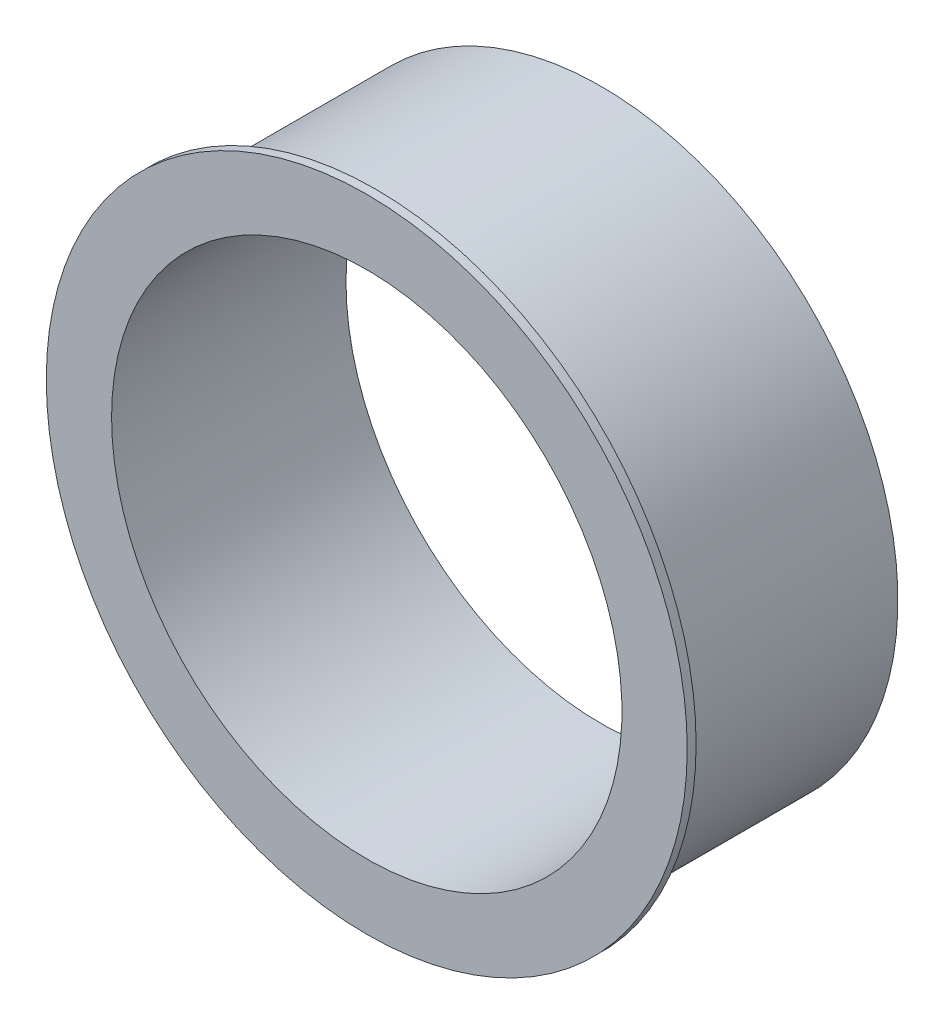
ISO-10303-21;
HEADER;
FILE_DESCRIPTION(('STEP AP214'),'2;1');
FILE_NAME('part.step','',(''),(''),'','','');
FILE_SCHEMA(('AUTOMOTIVE_DESIGN { 1 0 10303 214 1 1 1 1 }'));
ENDSEC;
DATA;
#1=APPLICATION_CONTEXT('core data for automotive mechanical design processes');
#2=APPLICATION_PROTOCOL_DEFINITION('international standard','automotive_design',2000,#1);
#3=PRODUCT_CONTEXT('',#1,'mechanical');
#4=PRODUCT('Part','Part','',(#3));
#5=PRODUCT_RELATED_PRODUCT_CATEGORY('part','',(#4));
#6=PRODUCT_DEFINITION_FORMATION('','',#4);
#7=PRODUCT_DEFINITION_CONTEXT('part definition',#1,'design');
#8=PRODUCT_DEFINITION('design','',#6,#7);
#9=PRODUCT_DEFINITION_SHAPE('','',#8);
#10=(LENGTH_UNIT() NAMED_UNIT(*) SI_UNIT(.MILLI.,.METRE.));
#11=(NAMED_UNIT(*) PLANE_ANGLE_UNIT() SI_UNIT($,.RADIAN.));
#12=(NAMED_UNIT(*) SI_UNIT($,.STERADIAN.) SOLID_ANGLE_UNIT());
#13=UNCERTAINTY_MEASURE_WITH_UNIT(LENGTH_MEASURE(1.E-05),#10,'distance_accuracy_value','');
#14=(GEOMETRIC_REPRESENTATION_CONTEXT(3) GLOBAL_UNCERTAINTY_ASSIGNED_CONTEXT((#13)) GLOBAL_UNIT_ASSIGNED_CONTEXT((#10,
#11,#12)) REPRESENTATION_CONTEXT('',''));
#15=CARTESIAN_POINT('',(0.,0.,0.));
#16=DIRECTION('',(0.,0.,1.));
#17=DIRECTION('',(1.,0.,0.));
#18=AXIS2_PLACEMENT_3D('',#15,#16,#17);
#19=CARTESIAN_POINT('',(0.,0.,-500.));
#20=DIRECTION('',(0.,0.,-1.));
#21=DIRECTION('',(-1.,0.,0.));
#22=AXIS2_PLACEMENT_3D('',#19,#20,#21);
#23=CYLINDRICAL_SURFACE('',#22,43.);
#24=CARTESIAN_POINT('',(0.,0.,-110.5));
#25=DIRECTION('',(0.,0.,-1.));
#26=DIRECTION('',(-1.,0.,0.));
#27=AXIS2_PLACEMENT_3D('',#24,#25,#26);
#28=CIRCLE('',#27,43.);
#29=CARTESIAN_POINT('',(-43.,0.,-110.5));
#30=VERTEX_POINT('',#29);
#31=EDGE_CURVE('E63',#30,#30,#28,.T.);
#32=ORIENTED_EDGE('',*,*,#31,.F.);
#33=EDGE_LOOP('',(#32));
#34=FACE_BOUND('',#33,.T.);
#35=CARTESIAN_POINT('',(0.,0.,-150.));
#36=DIRECTION('',(0.,0.,-1.));
#37=DIRECTION('',(-1.,0.,0.));
#38=AXIS2_PLACEMENT_3D('',#35,#36,#37);
#39=CIRCLE('',#38,43.);
#40=CARTESIAN_POINT('',(-43.,0.,-150.));
#41=VERTEX_POINT('',#40);
#42=EDGE_CURVE('E10',#41,#41,#39,.T.);
#43=ORIENTED_EDGE('',*,*,#42,.T.);
#44=EDGE_LOOP('',(#43));
#45=FACE_BOUND('',#44,.T.);
#46=ADVANCED_FACE('F41',(#34,#45),#23,.F.);
#47=CARTESIAN_POINT('',(43.,0.,-150.));
#48=DIRECTION('',(0.,0.,1.));
#49=DIRECTION('',(1.,0.,0.));
#50=AXIS2_PLACEMENT_3D('',#47,#48,#49);
#51=PLANE('',#50);
#52=ORIENTED_EDGE('',*,*,#42,.F.);
#53=EDGE_LOOP('',(#52));
#54=FACE_BOUND('',#53,.T.);
#55=CARTESIAN_POINT('',(0.,0.,-150.));
#56=DIRECTION('',(0.,0.,-1.));
#57=DIRECTION('',(-1.,0.,0.));
#58=AXIS2_PLACEMENT_3D('',#55,#56,#57);
#59=CIRCLE('',#58,50.);
#60=CARTESIAN_POINT('',(-50.,0.,-150.));
#61=VERTEX_POINT('',#60);
#62=EDGE_CURVE('E47',#61,#61,#59,.T.);
#63=ORIENTED_EDGE('',*,*,#62,.T.);
#64=EDGE_LOOP('',(#63));
#65=FACE_BOUND('',#64,.T.);
#66=ADVANCED_FACE('F70',(#54,#65),#51,.F.);
#67=CARTESIAN_POINT('',(0.,0.,-500.));
#68=DIRECTION('',(0.,0.,-1.));
#69=DIRECTION('',(-1.,0.,0.));
#70=AXIS2_PLACEMENT_3D('',#67,#68,#69);
#71=CYLINDRICAL_SURFACE('',#70,50.);
#72=ORIENTED_EDGE('',*,*,#62,.F.);
#73=EDGE_LOOP('',(#72));
#74=FACE_BOUND('',#73,.T.);
#75=CARTESIAN_POINT('',(0.,0.,-112.));
#76=DIRECTION('',(0.,0.,-1.));
#77=DIRECTION('',(-1.,0.,0.));
#78=AXIS2_PLACEMENT_3D('',#75,#76,#77);
#79=CIRCLE('',#78,50.);
#80=CARTESIAN_POINT('',(-50.,0.,-112.));
#81=VERTEX_POINT('',#80);
#82=EDGE_CURVE('E51',#81,#81,#79,.T.);
#83=ORIENTED_EDGE('',*,*,#82,.T.);
#84=EDGE_LOOP('',(#83));
#85=FACE_BOUND('',#84,.T.);
#86=ADVANCED_FACE('F74',(#74,#85),#71,.T.);
#87=CARTESIAN_POINT('',(50.,0.,-112.));
#88=DIRECTION('',(0.,0.,1.));
#89=DIRECTION('',(1.,0.,0.));
#90=AXIS2_PLACEMENT_3D('',#87,#88,#89);
#91=PLANE('',#90);
#92=ORIENTED_EDGE('',*,*,#82,.F.);
#93=EDGE_LOOP('',(#92));
#94=FACE_BOUND('',#93,.T.);
#95=CARTESIAN_POINT('',(0.,0.,-112.));
#96=DIRECTION('',(0.,0.,-1.));
#97=DIRECTION('',(-1.,0.,0.));
#98=AXIS2_PLACEMENT_3D('',#95,#96,#97);
#99=CIRCLE('',#98,54.);
#100=CARTESIAN_POINT('',(-54.,0.,-112.));
#101=VERTEX_POINT('',#100);
#102=EDGE_CURVE('E55',#101,#101,#99,.T.);
#103=ORIENTED_EDGE('',*,*,#102,.T.);
#104=EDGE_LOOP('',(#103));
#105=FACE_BOUND('',#104,.T.);
#106=ADVANCED_FACE('F79',(#94,#105),#91,.F.);
#107=CARTESIAN_POINT('',(0.,0.,-500.));
#108=DIRECTION('',(0.,0.,-1.));
#109=DIRECTION('',(-1.,0.,0.));
#110=AXIS2_PLACEMENT_3D('',#107,#108,#109);
#111=CYLINDRICAL_SURFACE('',#110,54.);
#112=ORIENTED_EDGE('',*,*,#102,.F.);
#113=EDGE_LOOP('',(#112));
#114=FACE_BOUND('',#113,.T.);
#115=CARTESIAN_POINT('',(0.,0.,-110.5));
#116=DIRECTION('',(0.,0.,-1.));
#117=DIRECTION('',(-1.,0.,0.));
#118=AXIS2_PLACEMENT_3D('',#115,#116,#117);
#119=CIRCLE('',#118,54.);
#120=CARTESIAN_POINT('',(-54.,0.,-110.5));
#121=VERTEX_POINT('',#120);
#122=EDGE_CURVE('E60',#121,#121,#119,.T.);
#123=ORIENTED_EDGE('',*,*,#122,.T.);
#124=EDGE_LOOP('',(#123));
#125=FACE_BOUND('',#124,.T.);
#126=ADVANCED_FACE('F85',(#114,#125),#111,.T.);
#127=CARTESIAN_POINT('',(54.,0.,-110.5));
#128=DIRECTION('',(0.,0.,-1.));
#129=DIRECTION('',(-1.,0.,0.));
#130=AXIS2_PLACEMENT_3D('',#127,#128,#129);
#131=PLANE('',#130);
#132=ORIENTED_EDGE('',*,*,#122,.F.);
#133=EDGE_LOOP('',(#132));
#134=FACE_BOUND('',#133,.T.);
#135=ORIENTED_EDGE('',*,*,#31,.T.);
#136=EDGE_LOOP('',(#135));
#137=FACE_BOUND('',#136,.T.);
#138=ADVANCED_FACE('F67',(#134,#137),#131,.F.);
#139=CLOSED_SHELL('',(#46,#66,#86,#106,#126,#138));
#140=MANIFOLD_SOLID_BREP('B2',#139);
#141=ADVANCED_BREP_SHAPE_REPRESENTATION('',(#18,#140),#14);
#142=SHAPE_DEFINITION_REPRESENTATION(#9,#141);
ENDSEC;
END-ISO-10303-21;
